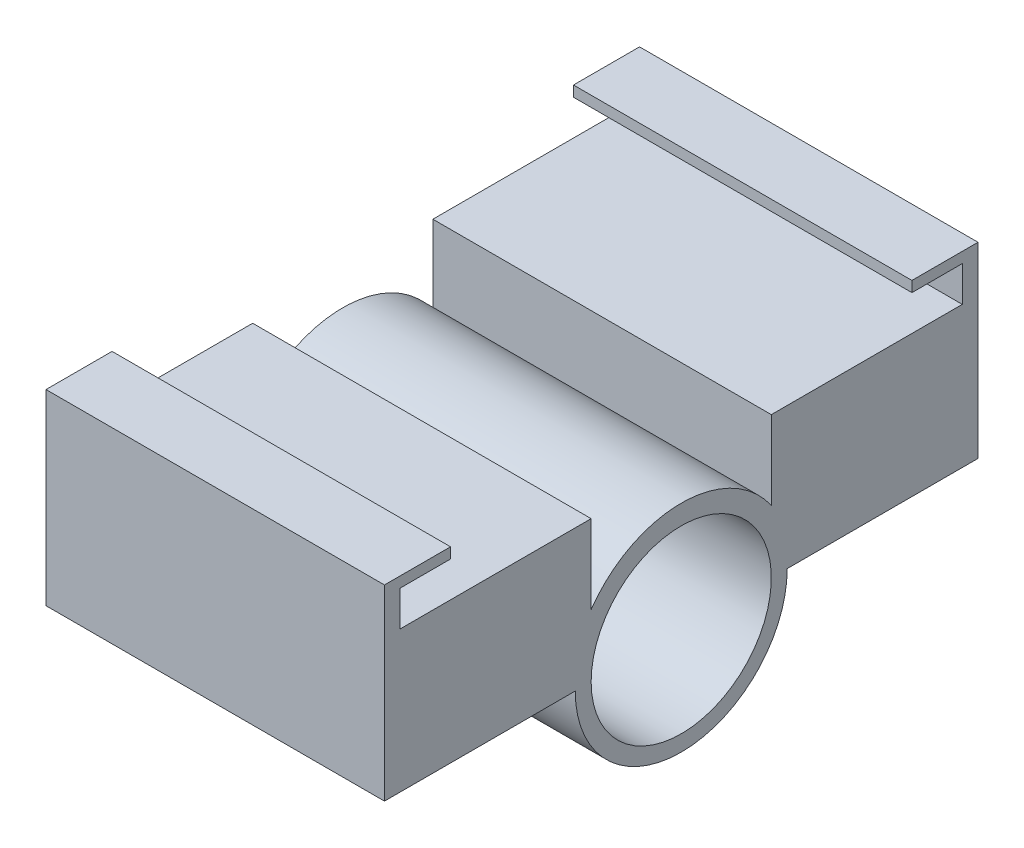
ISO-10303-21;
HEADER;
FILE_DESCRIPTION(('STEP AP214'),'2;1');
FILE_NAME('part.step','',(''),(''),'','','');
FILE_SCHEMA(('AUTOMOTIVE_DESIGN { 1 0 10303 214 1 1 1 1 }'));
ENDSEC;
DATA;
#1=APPLICATION_CONTEXT('core data for automotive mechanical design processes');
#2=APPLICATION_PROTOCOL_DEFINITION('international standard','automotive_design',2000,#1);
#3=PRODUCT_CONTEXT('',#1,'mechanical');
#4=PRODUCT('Part','Part','',(#3));
#5=PRODUCT_RELATED_PRODUCT_CATEGORY('part','',(#4));
#6=PRODUCT_DEFINITION_FORMATION('','',#4);
#7=PRODUCT_DEFINITION_CONTEXT('part definition',#1,'design');
#8=PRODUCT_DEFINITION('design','',#6,#7);
#9=PRODUCT_DEFINITION_SHAPE('','',#8);
#10=(LENGTH_UNIT() NAMED_UNIT(*) SI_UNIT(.MILLI.,.METRE.));
#11=(NAMED_UNIT(*) PLANE_ANGLE_UNIT() SI_UNIT($,.RADIAN.));
#12=(NAMED_UNIT(*) SI_UNIT($,.STERADIAN.) SOLID_ANGLE_UNIT());
#13=UNCERTAINTY_MEASURE_WITH_UNIT(LENGTH_MEASURE(1.E-05),#10,'distance_accuracy_value','');
#14=(GEOMETRIC_REPRESENTATION_CONTEXT(3) GLOBAL_UNCERTAINTY_ASSIGNED_CONTEXT((#13)) GLOBAL_UNIT_ASSIGNED_CONTEXT((#10,
#11,#12)) REPRESENTATION_CONTEXT('',''));
#15=CARTESIAN_POINT('',(0.,0.,0.));
#16=DIRECTION('',(0.,0.,1.));
#17=DIRECTION('',(1.,0.,0.));
#18=AXIS2_PLACEMENT_3D('',#15,#16,#17);
#19=CARTESIAN_POINT('',(47.9,0.,0.));
#20=DIRECTION('',(-1.,0.,0.));
#21=DIRECTION('',(0.,0.,1.));
#22=AXIS2_PLACEMENT_3D('',#19,#20,#21);
#23=PLANE('',#22);
#24=DIRECTION('',(0.,-1.,0.));
#25=VECTOR('',#24,1.);
#26=CARTESIAN_POINT('',(47.9,0.,42.));
#27=LINE('',#26,#25);
#28=CARTESIAN_POINT('',(47.9,26.5,42.));
#29=VERTEX_POINT('',#28);
#30=CARTESIAN_POINT('',(47.9,0.,42.));
#31=VERTEX_POINT('',#30);
#32=EDGE_CURVE('E231',#29,#31,#27,.T.);
#33=ORIENTED_EDGE('',*,*,#32,.T.);
#34=DIRECTION('',(0.,0.,-1.));
#35=VECTOR('',#34,1.);
#36=CARTESIAN_POINT('',(47.9,0.,15.));
#37=LINE('',#36,#35);
#38=CARTESIAN_POINT('',(47.9,0.,15.));
#39=VERTEX_POINT('',#38);
#40=EDGE_CURVE('E129',#31,#39,#37,.T.);
#41=ORIENTED_EDGE('',*,*,#40,.T.);
#42=CARTESIAN_POINT('',(47.9,0.,0.));
#43=DIRECTION('',(1.,0.,0.));
#44=DIRECTION('',(0.,0.,-1.));
#45=AXIS2_PLACEMENT_3D('',#42,#43,#44);
#46=CIRCLE('',#45,15.);
#47=CARTESIAN_POINT('',(47.9,0.,-15.));
#48=VERTEX_POINT('',#47);
#49=EDGE_CURVE('E276',#39,#48,#46,.T.);
#50=ORIENTED_EDGE('',*,*,#49,.T.);
#51=DIRECTION('',(0.,0.,-1.));
#52=VECTOR('',#51,1.);
#53=CARTESIAN_POINT('',(47.9,0.,-15.));
#54=LINE('',#53,#52);
#55=CARTESIAN_POINT('',(47.9,0.,-42.));
#56=VERTEX_POINT('',#55);
#57=EDGE_CURVE('E295',#48,#56,#54,.T.);
#58=ORIENTED_EDGE('',*,*,#57,.T.);
#59=DIRECTION('',(0.,1.,0.));
#60=VECTOR('',#59,1.);
#61=CARTESIAN_POINT('',(47.9,0.,-42.));
#62=LINE('',#61,#60);
#63=CARTESIAN_POINT('',(47.9,26.5,-42.));
#64=VERTEX_POINT('',#63);
#65=EDGE_CURVE('E292',#56,#64,#62,.T.);
#66=ORIENTED_EDGE('',*,*,#65,.T.);
#67=DIRECTION('',(0.,0.,1.));
#68=VECTOR('',#67,1.);
#69=CARTESIAN_POINT('',(47.9,26.5,-42.));
#70=LINE('',#69,#68);
#71=CARTESIAN_POINT('',(47.9,26.5,-32.65));
#72=VERTEX_POINT('',#71);
#73=EDGE_CURVE('E294',#64,#72,#70,.T.);
#74=ORIENTED_EDGE('',*,*,#73,.T.);
#75=DIRECTION('',(0.,-1.,0.));
#76=VECTOR('',#75,1.);
#77=CARTESIAN_POINT('',(47.9,26.5,-32.65));
#78=LINE('',#77,#76);
#79=CARTESIAN_POINT('',(47.9,25.,-32.65));
#80=VERTEX_POINT('',#79);
#81=EDGE_CURVE('E297',#72,#80,#78,.T.);
#82=ORIENTED_EDGE('',*,*,#81,.T.);
#83=DIRECTION('',(0.,0.,-1.));
#84=VECTOR('',#83,1.);
#85=CARTESIAN_POINT('',(47.9,25.,-32.65));
#86=LINE('',#85,#84);
#87=CARTESIAN_POINT('',(47.9,25.,-39.775));
#88=VERTEX_POINT('',#87);
#89=EDGE_CURVE('E303',#80,#88,#86,.T.);
#90=ORIENTED_EDGE('',*,*,#89,.T.);
#91=DIRECTION('',(0.,-1.,0.));
#92=VECTOR('',#91,1.);
#93=CARTESIAN_POINT('',(47.9,25.,-39.775));
#94=LINE('',#93,#92);
#95=CARTESIAN_POINT('',(47.9,20.,-39.775));
#96=VERTEX_POINT('',#95);
#97=EDGE_CURVE('E305',#88,#96,#94,.T.);
#98=ORIENTED_EDGE('',*,*,#97,.T.);
#99=DIRECTION('',(0.,0.,1.));
#100=VECTOR('',#99,1.);
#101=CARTESIAN_POINT('',(47.9,20.,-39.775));
#102=LINE('',#101,#100);
#103=CARTESIAN_POINT('',(47.9,20.,-12.75));
#104=VERTEX_POINT('',#103);
#105=EDGE_CURVE('E307',#96,#104,#102,.T.);
#106=ORIENTED_EDGE('',*,*,#105,.T.);
#107=DIRECTION('',(0.,-1.,0.));
#108=VECTOR('',#107,1.);
#109=CARTESIAN_POINT('',(47.9,20.,-12.75));
#110=LINE('',#109,#108);
#111=CARTESIAN_POINT('',(47.9,8.86510011223786,-12.75));
#112=VERTEX_POINT('',#111);
#113=EDGE_CURVE('E309',#104,#112,#110,.T.);
#114=ORIENTED_EDGE('',*,*,#113,.T.);
#115=CARTESIAN_POINT('',(47.9,0.,0.));
#116=DIRECTION('',(1.,0.,0.));
#117=DIRECTION('',(0.,0.,1.));
#118=AXIS2_PLACEMENT_3D('',#115,#116,#117);
#119=CIRCLE('',#118,15.5290856137765);
#120=CARTESIAN_POINT('',(47.9,8.86510011223786,12.75));
#121=VERTEX_POINT('',#120);
#122=EDGE_CURVE('E311',#112,#121,#119,.T.);
#123=ORIENTED_EDGE('',*,*,#122,.T.);
#124=DIRECTION('',(0.,1.,0.));
#125=VECTOR('',#124,1.);
#126=CARTESIAN_POINT('',(47.9,20.,12.75));
#127=LINE('',#126,#125);
#128=CARTESIAN_POINT('',(47.9,20.,12.75));
#129=VERTEX_POINT('',#128);
#130=EDGE_CURVE('E313',#121,#129,#127,.T.);
#131=ORIENTED_EDGE('',*,*,#130,.T.);
#132=DIRECTION('',(0.,0.,1.));
#133=VECTOR('',#132,1.);
#134=CARTESIAN_POINT('',(47.9,20.,39.775));
#135=LINE('',#134,#133);
#136=CARTESIAN_POINT('',(47.9,20.,39.775));
#137=VERTEX_POINT('',#136);
#138=EDGE_CURVE('E315',#129,#137,#135,.T.);
#139=ORIENTED_EDGE('',*,*,#138,.T.);
#140=DIRECTION('',(0.,1.,0.));
#141=VECTOR('',#140,1.);
#142=CARTESIAN_POINT('',(47.9,25.,39.775));
#143=LINE('',#142,#141);
#144=CARTESIAN_POINT('',(47.9,25.,39.775));
#145=VERTEX_POINT('',#144);
#146=EDGE_CURVE('E178',#137,#145,#143,.T.);
#147=ORIENTED_EDGE('',*,*,#146,.T.);
#148=DIRECTION('',(0.,0.,-1.));
#149=VECTOR('',#148,1.);
#150=CARTESIAN_POINT('',(47.9,25.,32.65));
#151=LINE('',#150,#149);
#152=CARTESIAN_POINT('',(47.9,25.,32.65));
#153=VERTEX_POINT('',#152);
#154=EDGE_CURVE('E172',#145,#153,#151,.T.);
#155=ORIENTED_EDGE('',*,*,#154,.T.);
#156=DIRECTION('',(0.,1.,0.));
#157=VECTOR('',#156,1.);
#158=CARTESIAN_POINT('',(47.9,26.5,32.65));
#159=LINE('',#158,#157);
#160=CARTESIAN_POINT('',(47.9,26.5,32.65));
#161=VERTEX_POINT('',#160);
#162=EDGE_CURVE('E176',#153,#161,#159,.T.);
#163=ORIENTED_EDGE('',*,*,#162,.T.);
#164=DIRECTION('',(0.,0.,1.));
#165=VECTOR('',#164,1.);
#166=CARTESIAN_POINT('',(47.9,26.5,42.));
#167=LINE('',#166,#165);
#168=EDGE_CURVE('E56',#161,#29,#167,.T.);
#169=ORIENTED_EDGE('',*,*,#168,.T.);
#170=EDGE_LOOP('',(#33,#41,#50,#58,#66,#74,#82,#90,#98,#106,#114,#123,#131,#139,#147,#155,#163,#169));
#171=FACE_BOUND('',#170,.T.);
#172=CARTESIAN_POINT('',(47.9,0.,0.));
#173=DIRECTION('',(1.,0.,0.));
#174=DIRECTION('',(0.,0.,1.));
#175=AXIS2_PLACEMENT_3D('',#172,#173,#174);
#176=CIRCLE('',#175,12.75);
#177=CARTESIAN_POINT('',(47.9,0.,12.75));
#178=VERTEX_POINT('',#177);
#179=EDGE_CURVE('E200',#178,#178,#176,.T.);
#180=ORIENTED_EDGE('',*,*,#179,.F.);
#181=EDGE_LOOP('',(#180));
#182=FACE_BOUND('',#181,.T.);
#183=ADVANCED_FACE('F39',(#171,#182),#23,.F.);
#184=CARTESIAN_POINT('',(0.,0.,0.));
#185=DIRECTION('',(-1.,0.,0.));
#186=DIRECTION('',(0.,0.,1.));
#187=AXIS2_PLACEMENT_3D('',#184,#185,#186);
#188=PLANE('',#187);
#189=DIRECTION('',(0.,-1.,0.));
#190=VECTOR('',#189,1.);
#191=CARTESIAN_POINT('',(0.,0.,42.));
#192=LINE('',#191,#190);
#193=CARTESIAN_POINT('',(0.,26.5,42.));
#194=VERTEX_POINT('',#193);
#195=CARTESIAN_POINT('',(0.,0.,42.));
#196=VERTEX_POINT('',#195);
#197=EDGE_CURVE('E196',#194,#196,#192,.T.);
#198=ORIENTED_EDGE('',*,*,#197,.F.);
#199=DIRECTION('',(0.,0.,1.));
#200=VECTOR('',#199,1.);
#201=CARTESIAN_POINT('',(0.,26.5,42.));
#202=LINE('',#201,#200);
#203=CARTESIAN_POINT('',(0.,26.5,32.65));
#204=VERTEX_POINT('',#203);
#205=EDGE_CURVE('E121',#204,#194,#202,.T.);
#206=ORIENTED_EDGE('',*,*,#205,.F.);
#207=DIRECTION('',(0.,1.,0.));
#208=VECTOR('',#207,1.);
#209=CARTESIAN_POINT('',(0.,26.5,32.65));
#210=LINE('',#209,#208);
#211=CARTESIAN_POINT('',(0.,25.,32.65));
#212=VERTEX_POINT('',#211);
#213=EDGE_CURVE('E115',#212,#204,#210,.T.);
#214=ORIENTED_EDGE('',*,*,#213,.F.);
#215=DIRECTION('',(0.,0.,-1.));
#216=VECTOR('',#215,1.);
#217=CARTESIAN_POINT('',(0.,25.,32.65));
#218=LINE('',#217,#216);
#219=CARTESIAN_POINT('',(0.,25.,39.775));
#220=VERTEX_POINT('',#219);
#221=EDGE_CURVE('E186',#220,#212,#218,.T.);
#222=ORIENTED_EDGE('',*,*,#221,.F.);
#223=DIRECTION('',(0.,1.,0.));
#224=VECTOR('',#223,1.);
#225=CARTESIAN_POINT('',(0.,25.,39.775));
#226=LINE('',#225,#224);
#227=CARTESIAN_POINT('',(0.,20.,39.775));
#228=VERTEX_POINT('',#227);
#229=EDGE_CURVE('E226',#228,#220,#226,.T.);
#230=ORIENTED_EDGE('',*,*,#229,.F.);
#231=DIRECTION('',(0.,0.,1.));
#232=VECTOR('',#231,1.);
#233=CARTESIAN_POINT('',(0.,20.,39.775));
#234=LINE('',#233,#232);
#235=CARTESIAN_POINT('',(0.,20.,12.75));
#236=VERTEX_POINT('',#235);
#237=EDGE_CURVE('E224',#236,#228,#234,.T.);
#238=ORIENTED_EDGE('',*,*,#237,.F.);
#239=DIRECTION('',(0.,1.,0.));
#240=VECTOR('',#239,1.);
#241=CARTESIAN_POINT('',(0.,20.,12.75));
#242=LINE('',#241,#240);
#243=CARTESIAN_POINT('',(0.,8.86510011223786,12.75));
#244=VERTEX_POINT('',#243);
#245=EDGE_CURVE('E222',#244,#236,#242,.T.);
#246=ORIENTED_EDGE('',*,*,#245,.F.);
#247=CARTESIAN_POINT('',(0.,0.,0.));
#248=DIRECTION('',(1.,0.,0.));
#249=DIRECTION('',(0.,0.,1.));
#250=AXIS2_PLACEMENT_3D('',#247,#248,#249);
#251=CIRCLE('',#250,15.5290856137765);
#252=CARTESIAN_POINT('',(0.,8.86510011223786,-12.75));
#253=VERTEX_POINT('',#252);
#254=EDGE_CURVE('E220',#253,#244,#251,.T.);
#255=ORIENTED_EDGE('',*,*,#254,.F.);
#256=DIRECTION('',(0.,-1.,0.));
#257=VECTOR('',#256,1.);
#258=CARTESIAN_POINT('',(0.,20.,-12.75));
#259=LINE('',#258,#257);
#260=CARTESIAN_POINT('',(0.,20.,-12.75));
#261=VERTEX_POINT('',#260);
#262=EDGE_CURVE('E218',#261,#253,#259,.T.);
#263=ORIENTED_EDGE('',*,*,#262,.F.);
#264=DIRECTION('',(0.,0.,1.));
#265=VECTOR('',#264,1.);
#266=CARTESIAN_POINT('',(0.,20.,-39.775));
#267=LINE('',#266,#265);
#268=CARTESIAN_POINT('',(0.,20.,-39.775));
#269=VERTEX_POINT('',#268);
#270=EDGE_CURVE('E216',#269,#261,#267,.T.);
#271=ORIENTED_EDGE('',*,*,#270,.F.);
#272=DIRECTION('',(0.,-1.,0.));
#273=VECTOR('',#272,1.);
#274=CARTESIAN_POINT('',(0.,25.,-39.775));
#275=LINE('',#274,#273);
#276=CARTESIAN_POINT('',(0.,25.,-39.775));
#277=VERTEX_POINT('',#276);
#278=EDGE_CURVE('E214',#277,#269,#275,.T.);
#279=ORIENTED_EDGE('',*,*,#278,.F.);
#280=DIRECTION('',(0.,0.,-1.));
#281=VECTOR('',#280,1.);
#282=CARTESIAN_POINT('',(0.,25.,-32.65));
#283=LINE('',#282,#281);
#284=CARTESIAN_POINT('',(0.,25.,-32.65));
#285=VERTEX_POINT('',#284);
#286=EDGE_CURVE('E212',#285,#277,#283,.T.);
#287=ORIENTED_EDGE('',*,*,#286,.F.);
#288=DIRECTION('',(0.,-1.,0.));
#289=VECTOR('',#288,1.);
#290=CARTESIAN_POINT('',(0.,26.5,-32.65));
#291=LINE('',#290,#289);
#292=CARTESIAN_POINT('',(0.,26.5,-32.65));
#293=VERTEX_POINT('',#292);
#294=EDGE_CURVE('E210',#293,#285,#291,.T.);
#295=ORIENTED_EDGE('',*,*,#294,.F.);
#296=DIRECTION('',(0.,0.,1.));
#297=VECTOR('',#296,1.);
#298=CARTESIAN_POINT('',(0.,26.5,-42.));
#299=LINE('',#298,#297);
#300=CARTESIAN_POINT('',(0.,26.5,-42.));
#301=VERTEX_POINT('',#300);
#302=EDGE_CURVE('E208',#301,#293,#299,.T.);
#303=ORIENTED_EDGE('',*,*,#302,.F.);
#304=DIRECTION('',(0.,1.,0.));
#305=VECTOR('',#304,1.);
#306=CARTESIAN_POINT('',(0.,0.,-42.));
#307=LINE('',#306,#305);
#308=CARTESIAN_POINT('',(0.,0.,-42.));
#309=VERTEX_POINT('',#308);
#310=EDGE_CURVE('E206',#309,#301,#307,.T.);
#311=ORIENTED_EDGE('',*,*,#310,.F.);
#312=DIRECTION('',(0.,0.,-1.));
#313=VECTOR('',#312,1.);
#314=CARTESIAN_POINT('',(0.,0.,-15.));
#315=LINE('',#314,#313);
#316=CARTESIAN_POINT('',(0.,0.,-15.));
#317=VERTEX_POINT('',#316);
#318=EDGE_CURVE('E204',#317,#309,#315,.T.);
#319=ORIENTED_EDGE('',*,*,#318,.F.);
#320=CARTESIAN_POINT('',(0.,0.,0.));
#321=DIRECTION('',(1.,0.,0.));
#322=DIRECTION('',(0.,0.,-1.));
#323=AXIS2_PLACEMENT_3D('',#320,#321,#322);
#324=CIRCLE('',#323,15.);
#325=CARTESIAN_POINT('',(0.,0.,15.));
#326=VERTEX_POINT('',#325);
#327=EDGE_CURVE('E202',#326,#317,#324,.T.);
#328=ORIENTED_EDGE('',*,*,#327,.F.);
#329=DIRECTION('',(0.,0.,-1.));
#330=VECTOR('',#329,1.);
#331=CARTESIAN_POINT('',(0.,0.,15.));
#332=LINE('',#331,#330);
#333=EDGE_CURVE('E199',#196,#326,#332,.T.);
#334=ORIENTED_EDGE('',*,*,#333,.F.);
#335=EDGE_LOOP('',(#198,#206,#214,#222,#230,#238,#246,#255,#263,#271,#279,#287,#295,#303,#311,
#319,#328,#334));
#336=FACE_BOUND('',#335,.T.);
#337=CARTESIAN_POINT('',(0.,0.,0.));
#338=DIRECTION('',(1.,0.,0.));
#339=DIRECTION('',(0.,0.,-1.));
#340=AXIS2_PLACEMENT_3D('',#337,#338,#339);
#341=CIRCLE('',#340,12.75);
#342=CARTESIAN_POINT('',(0.,0.,-12.75));
#343=VERTEX_POINT('',#342);
#344=EDGE_CURVE('E583',#343,#343,#341,.T.);
#345=ORIENTED_EDGE('',*,*,#344,.T.);
#346=EDGE_LOOP('',(#345));
#347=FACE_BOUND('',#346,.T.);
#348=ADVANCED_FACE('F280',(#336,#347),#188,.T.);
#349=CARTESIAN_POINT('',(47.9,0.,42.));
#350=DIRECTION('',(0.,0.,-1.));
#351=DIRECTION('',(-1.,0.,0.));
#352=AXIS2_PLACEMENT_3D('',#349,#350,#351);
#353=PLANE('',#352);
#354=ORIENTED_EDGE('',*,*,#197,.T.);
#355=DIRECTION('',(-1.,0.,0.));
#356=VECTOR('',#355,1.);
#357=CARTESIAN_POINT('',(47.9,0.,42.));
#358=LINE('',#357,#356);
#359=EDGE_CURVE('E11',#31,#196,#358,.T.);
#360=ORIENTED_EDGE('',*,*,#359,.F.);
#361=ORIENTED_EDGE('',*,*,#32,.F.);
#362=DIRECTION('',(-1.,0.,0.));
#363=VECTOR('',#362,1.);
#364=CARTESIAN_POINT('',(47.9,26.5,42.));
#365=LINE('',#364,#363);
#366=EDGE_CURVE('E192',#29,#194,#365,.T.);
#367=ORIENTED_EDGE('',*,*,#366,.T.);
#368=EDGE_LOOP('',(#354,#360,#361,#367));
#369=FACE_BOUND('',#368,.T.);
#370=ADVANCED_FACE('F41',(#369),#353,.F.);
#371=CARTESIAN_POINT('',(47.9,0.,15.));
#372=DIRECTION('',(0.,1.,0.));
#373=DIRECTION('',(0.,0.,1.));
#374=AXIS2_PLACEMENT_3D('',#371,#372,#373);
#375=PLANE('',#374);
#376=ORIENTED_EDGE('',*,*,#333,.T.);
#377=DIRECTION('',(-1.,0.,0.));
#378=VECTOR('',#377,1.);
#379=CARTESIAN_POINT('',(47.9,0.,15.));
#380=LINE('',#379,#378);
#381=EDGE_CURVE('E48',#39,#326,#380,.T.);
#382=ORIENTED_EDGE('',*,*,#381,.F.);
#383=ORIENTED_EDGE('',*,*,#40,.F.);
#384=ORIENTED_EDGE('',*,*,#359,.T.);
#385=EDGE_LOOP('',(#376,#382,#383,#384));
#386=FACE_BOUND('',#385,.T.);
#387=ADVANCED_FACE('F349',(#386),#375,.F.);
#388=CARTESIAN_POINT('',(47.9,0.,0.));
#389=DIRECTION('',(-1.,0.,0.));
#390=DIRECTION('',(0.,0.,1.));
#391=AXIS2_PLACEMENT_3D('',#388,#389,#390);
#392=CYLINDRICAL_SURFACE('',#391,15.);
#393=ORIENTED_EDGE('',*,*,#327,.T.);
#394=DIRECTION('',(-1.,0.,0.));
#395=VECTOR('',#394,1.);
#396=CARTESIAN_POINT('',(47.9,0.,-15.));
#397=LINE('',#396,#395);
#398=EDGE_CURVE('E268',#48,#317,#397,.T.);
#399=ORIENTED_EDGE('',*,*,#398,.F.);
#400=ORIENTED_EDGE('',*,*,#49,.F.);
#401=ORIENTED_EDGE('',*,*,#381,.T.);
#402=EDGE_LOOP('',(#393,#399,#400,#401));
#403=FACE_BOUND('',#402,.T.);
#404=ADVANCED_FACE('F274',(#403),#392,.T.);
#405=CARTESIAN_POINT('',(47.9,0.,-15.));
#406=DIRECTION('',(0.,1.,0.));
#407=DIRECTION('',(0.,0.,1.));
#408=AXIS2_PLACEMENT_3D('',#405,#406,#407);
#409=PLANE('',#408);
#410=ORIENTED_EDGE('',*,*,#318,.T.);
#411=DIRECTION('',(-1.,0.,0.));
#412=VECTOR('',#411,1.);
#413=CARTESIAN_POINT('',(47.9,0.,-42.));
#414=LINE('',#413,#412);
#415=EDGE_CURVE('E265',#56,#309,#414,.T.);
#416=ORIENTED_EDGE('',*,*,#415,.F.);
#417=ORIENTED_EDGE('',*,*,#57,.F.);
#418=ORIENTED_EDGE('',*,*,#398,.T.);
#419=EDGE_LOOP('',(#410,#416,#417,#418));
#420=FACE_BOUND('',#419,.T.);
#421=ADVANCED_FACE('F286',(#420),#409,.F.);
#422=CARTESIAN_POINT('',(47.9,0.,-42.));
#423=DIRECTION('',(0.,0.,1.));
#424=DIRECTION('',(1.,0.,0.));
#425=AXIS2_PLACEMENT_3D('',#422,#423,#424);
#426=PLANE('',#425);
#427=ORIENTED_EDGE('',*,*,#310,.T.);
#428=DIRECTION('',(-1.,0.,0.));
#429=VECTOR('',#428,1.);
#430=CARTESIAN_POINT('',(47.9,26.5,-42.));
#431=LINE('',#430,#429);
#432=EDGE_CURVE('E262',#64,#301,#431,.T.);
#433=ORIENTED_EDGE('',*,*,#432,.F.);
#434=ORIENTED_EDGE('',*,*,#65,.F.);
#435=ORIENTED_EDGE('',*,*,#415,.T.);
#436=EDGE_LOOP('',(#427,#433,#434,#435));
#437=FACE_BOUND('',#436,.T.);
#438=ADVANCED_FACE('F290',(#437),#426,.F.);
#439=CARTESIAN_POINT('',(47.9,26.5,-42.));
#440=DIRECTION('',(0.,-1.,0.));
#441=DIRECTION('',(0.,0.,-1.));
#442=AXIS2_PLACEMENT_3D('',#439,#440,#441);
#443=PLANE('',#442);
#444=ORIENTED_EDGE('',*,*,#302,.T.);
#445=DIRECTION('',(-1.,0.,0.));
#446=VECTOR('',#445,1.);
#447=CARTESIAN_POINT('',(47.9,26.5,-32.65));
#448=LINE('',#447,#446);
#449=EDGE_CURVE('E259',#72,#293,#448,.T.);
#450=ORIENTED_EDGE('',*,*,#449,.F.);
#451=ORIENTED_EDGE('',*,*,#73,.F.);
#452=ORIENTED_EDGE('',*,*,#432,.T.);
#453=EDGE_LOOP('',(#444,#450,#451,#452));
#454=FACE_BOUND('',#453,.T.);
#455=ADVANCED_FACE('F362',(#454),#443,.F.);
#456=CARTESIAN_POINT('',(47.9,26.5,-32.65));
#457=DIRECTION('',(0.,0.,-1.));
#458=DIRECTION('',(-1.,0.,0.));
#459=AXIS2_PLACEMENT_3D('',#456,#457,#458);
#460=PLANE('',#459);
#461=ORIENTED_EDGE('',*,*,#294,.T.);
#462=DIRECTION('',(-1.,0.,0.));
#463=VECTOR('',#462,1.);
#464=CARTESIAN_POINT('',(47.9,25.,-32.65));
#465=LINE('',#464,#463);
#466=EDGE_CURVE('E256',#80,#285,#465,.T.);
#467=ORIENTED_EDGE('',*,*,#466,.F.);
#468=ORIENTED_EDGE('',*,*,#81,.F.);
#469=ORIENTED_EDGE('',*,*,#449,.T.);
#470=EDGE_LOOP('',(#461,#467,#468,#469));
#471=FACE_BOUND('',#470,.T.);
#472=ADVANCED_FACE('F365',(#471),#460,.F.);
#473=CARTESIAN_POINT('',(47.9,25.,-32.65));
#474=DIRECTION('',(0.,1.,0.));
#475=DIRECTION('',(0.,0.,1.));
#476=AXIS2_PLACEMENT_3D('',#473,#474,#475);
#477=PLANE('',#476);
#478=ORIENTED_EDGE('',*,*,#286,.T.);
#479=DIRECTION('',(-1.,0.,0.));
#480=VECTOR('',#479,1.);
#481=CARTESIAN_POINT('',(47.9,25.,-39.775));
#482=LINE('',#481,#480);
#483=EDGE_CURVE('E253',#88,#277,#482,.T.);
#484=ORIENTED_EDGE('',*,*,#483,.F.);
#485=ORIENTED_EDGE('',*,*,#89,.F.);
#486=ORIENTED_EDGE('',*,*,#466,.T.);
#487=EDGE_LOOP('',(#478,#484,#485,#486));
#488=FACE_BOUND('',#487,.T.);
#489=ADVANCED_FACE('F369',(#488),#477,.F.);
#490=CARTESIAN_POINT('',(47.9,25.,-39.775));
#491=DIRECTION('',(0.,0.,-1.));
#492=DIRECTION('',(-1.,0.,0.));
#493=AXIS2_PLACEMENT_3D('',#490,#491,#492);
#494=PLANE('',#493);
#495=ORIENTED_EDGE('',*,*,#278,.T.);
#496=DIRECTION('',(-1.,0.,0.));
#497=VECTOR('',#496,1.);
#498=CARTESIAN_POINT('',(47.9,20.,-39.775));
#499=LINE('',#498,#497);
#500=EDGE_CURVE('E250',#96,#269,#499,.T.);
#501=ORIENTED_EDGE('',*,*,#500,.F.);
#502=ORIENTED_EDGE('',*,*,#97,.F.);
#503=ORIENTED_EDGE('',*,*,#483,.T.);
#504=EDGE_LOOP('',(#495,#501,#502,#503));
#505=FACE_BOUND('',#504,.T.);
#506=ADVANCED_FACE('F373',(#505),#494,.F.);
#507=CARTESIAN_POINT('',(47.9,20.,-39.775));
#508=DIRECTION('',(0.,-1.,0.));
#509=DIRECTION('',(0.,0.,-1.));
#510=AXIS2_PLACEMENT_3D('',#507,#508,#509);
#511=PLANE('',#510);
#512=ORIENTED_EDGE('',*,*,#270,.T.);
#513=DIRECTION('',(-1.,0.,0.));
#514=VECTOR('',#513,1.);
#515=CARTESIAN_POINT('',(47.9,20.,-12.75));
#516=LINE('',#515,#514);
#517=EDGE_CURVE('E247',#104,#261,#516,.T.);
#518=ORIENTED_EDGE('',*,*,#517,.F.);
#519=ORIENTED_EDGE('',*,*,#105,.F.);
#520=ORIENTED_EDGE('',*,*,#500,.T.);
#521=EDGE_LOOP('',(#512,#518,#519,#520));
#522=FACE_BOUND('',#521,.T.);
#523=ADVANCED_FACE('F377',(#522),#511,.F.);
#524=CARTESIAN_POINT('',(47.9,20.,-12.75));
#525=DIRECTION('',(0.,0.,-1.));
#526=DIRECTION('',(0.,1.,0.));
#527=AXIS2_PLACEMENT_3D('',#524,#525,#526);
#528=PLANE('',#527);
#529=ORIENTED_EDGE('',*,*,#262,.T.);
#530=DIRECTION('',(-1.,0.,0.));
#531=VECTOR('',#530,1.);
#532=CARTESIAN_POINT('',(47.9,8.86510011223786,-12.75));
#533=LINE('',#532,#531);
#534=EDGE_CURVE('E244',#112,#253,#533,.T.);
#535=ORIENTED_EDGE('',*,*,#534,.F.);
#536=ORIENTED_EDGE('',*,*,#113,.F.);
#537=ORIENTED_EDGE('',*,*,#517,.T.);
#538=EDGE_LOOP('',(#529,#535,#536,#537));
#539=FACE_BOUND('',#538,.T.);
#540=ADVANCED_FACE('F381',(#539),#528,.F.);
#541=CARTESIAN_POINT('',(47.9,0.,0.));
#542=DIRECTION('',(-1.,0.,0.));
#543=DIRECTION('',(0.,0.,1.));
#544=AXIS2_PLACEMENT_3D('',#541,#542,#543);
#545=CYLINDRICAL_SURFACE('',#544,15.5290856137765);
#546=ORIENTED_EDGE('',*,*,#254,.T.);
#547=DIRECTION('',(-1.,0.,0.));
#548=VECTOR('',#547,1.);
#549=CARTESIAN_POINT('',(47.9,8.86510011223786,12.75));
#550=LINE('',#549,#548);
#551=EDGE_CURVE('E241',#121,#244,#550,.T.);
#552=ORIENTED_EDGE('',*,*,#551,.F.);
#553=ORIENTED_EDGE('',*,*,#122,.F.);
#554=ORIENTED_EDGE('',*,*,#534,.T.);
#555=EDGE_LOOP('',(#546,#552,#553,#554));
#556=FACE_BOUND('',#555,.T.);
#557=ADVANCED_FACE('F385',(#556),#545,.T.);
#558=CARTESIAN_POINT('',(47.9,20.,12.75));
#559=DIRECTION('',(0.,0.,1.));
#560=DIRECTION('',(0.,-1.,0.));
#561=AXIS2_PLACEMENT_3D('',#558,#559,#560);
#562=PLANE('',#561);
#563=ORIENTED_EDGE('',*,*,#245,.T.);
#564=DIRECTION('',(-1.,0.,0.));
#565=VECTOR('',#564,1.);
#566=CARTESIAN_POINT('',(47.9,20.,12.75));
#567=LINE('',#566,#565);
#568=EDGE_CURVE('E238',#129,#236,#567,.T.);
#569=ORIENTED_EDGE('',*,*,#568,.F.);
#570=ORIENTED_EDGE('',*,*,#130,.F.);
#571=ORIENTED_EDGE('',*,*,#551,.T.);
#572=EDGE_LOOP('',(#563,#569,#570,#571));
#573=FACE_BOUND('',#572,.T.);
#574=ADVANCED_FACE('F389',(#573),#562,.F.);
#575=CARTESIAN_POINT('',(47.9,20.,39.775));
#576=DIRECTION('',(0.,-1.,0.));
#577=DIRECTION('',(0.,0.,-1.));
#578=AXIS2_PLACEMENT_3D('',#575,#576,#577);
#579=PLANE('',#578);
#580=ORIENTED_EDGE('',*,*,#237,.T.);
#581=DIRECTION('',(-1.,0.,0.));
#582=VECTOR('',#581,1.);
#583=CARTESIAN_POINT('',(47.9,20.,39.775));
#584=LINE('',#583,#582);
#585=EDGE_CURVE('E235',#137,#228,#584,.T.);
#586=ORIENTED_EDGE('',*,*,#585,.F.);
#587=ORIENTED_EDGE('',*,*,#138,.F.);
#588=ORIENTED_EDGE('',*,*,#568,.T.);
#589=EDGE_LOOP('',(#580,#586,#587,#588));
#590=FACE_BOUND('',#589,.T.);
#591=ADVANCED_FACE('F321',(#590),#579,.F.);
#592=CARTESIAN_POINT('',(47.9,25.,39.775));
#593=DIRECTION('',(0.,0.,1.));
#594=DIRECTION('',(1.,0.,0.));
#595=AXIS2_PLACEMENT_3D('',#592,#593,#594);
#596=PLANE('',#595);
#597=ORIENTED_EDGE('',*,*,#229,.T.);
#598=DIRECTION('',(-1.,0.,0.));
#599=VECTOR('',#598,1.);
#600=CARTESIAN_POINT('',(47.9,25.,39.775));
#601=LINE('',#600,#599);
#602=EDGE_CURVE('E187',#145,#220,#601,.T.);
#603=ORIENTED_EDGE('',*,*,#602,.F.);
#604=ORIENTED_EDGE('',*,*,#146,.F.);
#605=ORIENTED_EDGE('',*,*,#585,.T.);
#606=EDGE_LOOP('',(#597,#603,#604,#605));
#607=FACE_BOUND('',#606,.T.);
#608=ADVANCED_FACE('F325',(#607),#596,.F.);
#609=CARTESIAN_POINT('',(47.9,25.,32.65));
#610=DIRECTION('',(0.,1.,0.));
#611=DIRECTION('',(0.,0.,1.));
#612=AXIS2_PLACEMENT_3D('',#609,#610,#611);
#613=PLANE('',#612);
#614=ORIENTED_EDGE('',*,*,#221,.T.);
#615=DIRECTION('',(-1.,0.,0.));
#616=VECTOR('',#615,1.);
#617=CARTESIAN_POINT('',(47.9,25.,32.65));
#618=LINE('',#617,#616);
#619=EDGE_CURVE('E183',#153,#212,#618,.T.);
#620=ORIENTED_EDGE('',*,*,#619,.F.);
#621=ORIENTED_EDGE('',*,*,#154,.F.);
#622=ORIENTED_EDGE('',*,*,#602,.T.);
#623=EDGE_LOOP('',(#614,#620,#621,#622));
#624=FACE_BOUND('',#623,.T.);
#625=ADVANCED_FACE('F184',(#624),#613,.F.);
#626=CARTESIAN_POINT('',(47.9,26.5,32.65));
#627=DIRECTION('',(0.,0.,1.));
#628=DIRECTION('',(1.,0.,0.));
#629=AXIS2_PLACEMENT_3D('',#626,#627,#628);
#630=PLANE('',#629);
#631=ORIENTED_EDGE('',*,*,#213,.T.);
#632=DIRECTION('',(-1.,0.,0.));
#633=VECTOR('',#632,1.);
#634=CARTESIAN_POINT('',(47.9,26.5,32.65));
#635=LINE('',#634,#633);
#636=EDGE_CURVE('E188',#161,#204,#635,.T.);
#637=ORIENTED_EDGE('',*,*,#636,.F.);
#638=ORIENTED_EDGE('',*,*,#162,.F.);
#639=ORIENTED_EDGE('',*,*,#619,.T.);
#640=EDGE_LOOP('',(#631,#637,#638,#639));
#641=FACE_BOUND('',#640,.T.);
#642=ADVANCED_FACE('F190',(#641),#630,.F.);
#643=CARTESIAN_POINT('',(47.9,26.5,42.));
#644=DIRECTION('',(0.,-1.,0.));
#645=DIRECTION('',(0.,0.,-1.));
#646=AXIS2_PLACEMENT_3D('',#643,#644,#645);
#647=PLANE('',#646);
#648=ORIENTED_EDGE('',*,*,#205,.T.);
#649=ORIENTED_EDGE('',*,*,#366,.F.);
#650=ORIENTED_EDGE('',*,*,#168,.F.);
#651=ORIENTED_EDGE('',*,*,#636,.T.);
#652=EDGE_LOOP('',(#648,#649,#650,#651));
#653=FACE_BOUND('',#652,.T.);
#654=ADVANCED_FACE('F329',(#653),#647,.F.);
#655=CARTESIAN_POINT('',(47.9,0.,0.));
#656=DIRECTION('',(-1.,0.,0.));
#657=DIRECTION('',(0.,0.,1.));
#658=AXIS2_PLACEMENT_3D('',#655,#656,#657);
#659=CYLINDRICAL_SURFACE('',#658,12.75);
#660=ORIENTED_EDGE('',*,*,#344,.F.);
#661=EDGE_LOOP('',(#660));
#662=FACE_BOUND('',#661,.T.);
#663=ORIENTED_EDGE('',*,*,#179,.T.);
#664=EDGE_LOOP('',(#663));
#665=FACE_BOUND('',#664,.T.);
#666=ADVANCED_FACE('F331',(#662,#665),#659,.F.);
#667=CLOSED_SHELL('',(#183,#348,#370,#387,#404,#421,#438,#455,#472,#489,#506,#523,#540,#557,
#574,#591,#608,#625,#642,#654,#666));
#668=MANIFOLD_SOLID_BREP('B2',#667);
#669=ADVANCED_BREP_SHAPE_REPRESENTATION('',(#18,#668),#14);
#670=SHAPE_DEFINITION_REPRESENTATION(#9,#669);
ENDSEC;
END-ISO-10303-21;
